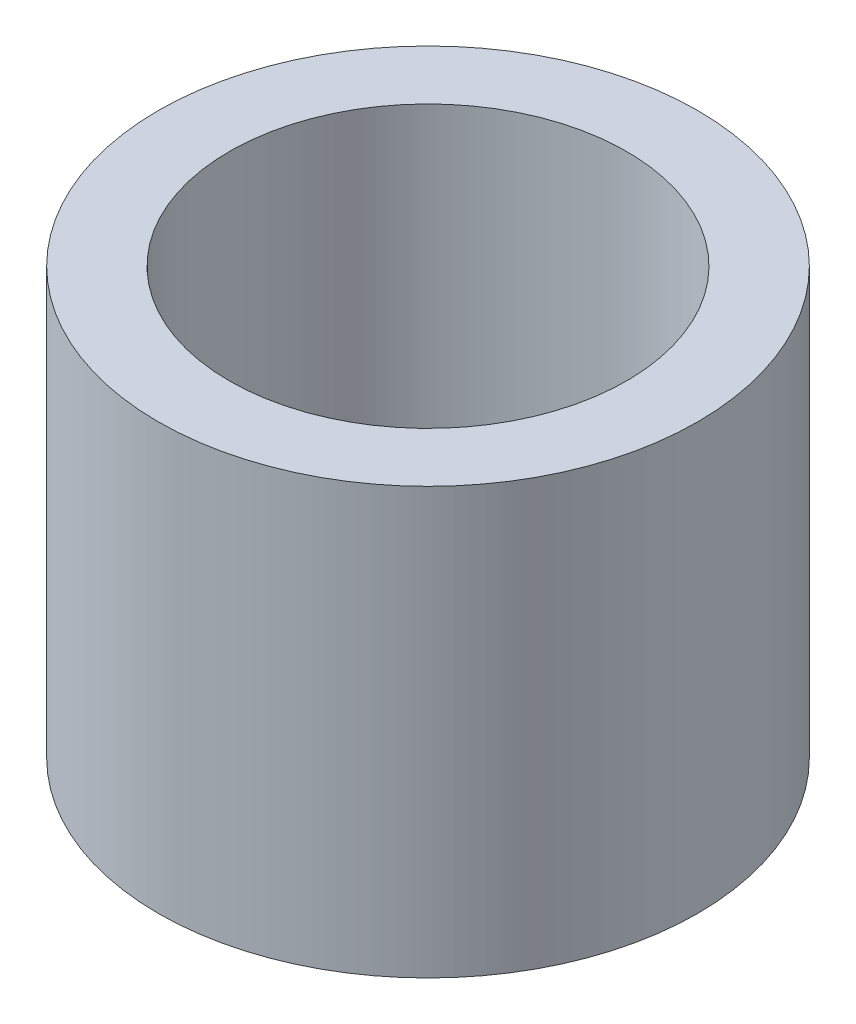
ISO-10303-21;
HEADER;
FILE_DESCRIPTION(('STEP AP214'),'2;1');
FILE_NAME('part.step','',(''),(''),'','','');
FILE_SCHEMA(('AUTOMOTIVE_DESIGN { 1 0 10303 214 1 1 1 1 }'));
ENDSEC;
DATA;
#1=APPLICATION_CONTEXT('core data for automotive mechanical design processes');
#2=APPLICATION_PROTOCOL_DEFINITION('international standard','automotive_design',2000,#1);
#3=PRODUCT_CONTEXT('',#1,'mechanical');
#4=PRODUCT('Part','Part','',(#3));
#5=PRODUCT_RELATED_PRODUCT_CATEGORY('part','',(#4));
#6=PRODUCT_DEFINITION_FORMATION('','',#4);
#7=PRODUCT_DEFINITION_CONTEXT('part definition',#1,'design');
#8=PRODUCT_DEFINITION('design','',#6,#7);
#9=PRODUCT_DEFINITION_SHAPE('','',#8);
#10=(LENGTH_UNIT() NAMED_UNIT(*) SI_UNIT(.MILLI.,.METRE.));
#11=(NAMED_UNIT(*) PLANE_ANGLE_UNIT() SI_UNIT($,.RADIAN.));
#12=(NAMED_UNIT(*) SI_UNIT($,.STERADIAN.) SOLID_ANGLE_UNIT());
#13=UNCERTAINTY_MEASURE_WITH_UNIT(LENGTH_MEASURE(1.E-05),#10,'distance_accuracy_value','');
#14=(GEOMETRIC_REPRESENTATION_CONTEXT(3) GLOBAL_UNCERTAINTY_ASSIGNED_CONTEXT((#13)) GLOBAL_UNIT_ASSIGNED_CONTEXT((#10,
#11,#12)) REPRESENTATION_CONTEXT('',''));
#15=CARTESIAN_POINT('',(0.,0.,0.));
#16=DIRECTION('',(0.,0.,1.));
#17=DIRECTION('',(1.,0.,0.));
#18=AXIS2_PLACEMENT_3D('',#15,#16,#17);
#19=CARTESIAN_POINT('',(0.,3.75,0.));
#20=DIRECTION('',(0.,1.,0.));
#21=DIRECTION('',(0.,0.,1.));
#22=AXIS2_PLACEMENT_3D('',#19,#20,#21);
#23=PLANE('',#22);
#24=CARTESIAN_POINT('',(0.,3.75,0.));
#25=DIRECTION('',(0.,1.,0.));
#26=DIRECTION('',(0.,0.,1.));
#27=AXIS2_PLACEMENT_3D('',#24,#25,#26);
#28=CIRCLE('',#27,4.75);
#29=CARTESIAN_POINT('',(0.,3.75,4.75));
#30=VERTEX_POINT('',#29);
#31=EDGE_CURVE('E10',#30,#30,#28,.T.);
#32=ORIENTED_EDGE('',*,*,#31,.T.);
#33=EDGE_LOOP('',(#32));
#34=FACE_BOUND('',#33,.T.);
#35=CARTESIAN_POINT('',(0.,3.75,0.));
#36=DIRECTION('',(0.,1.,0.));
#37=DIRECTION('',(0.,0.,1.));
#38=AXIS2_PLACEMENT_3D('',#35,#36,#37);
#39=CIRCLE('',#38,3.5);
#40=CARTESIAN_POINT('',(0.,3.75,3.5));
#41=VERTEX_POINT('',#40);
#42=EDGE_CURVE('E54',#41,#41,#39,.T.);
#43=ORIENTED_EDGE('',*,*,#42,.F.);
#44=EDGE_LOOP('',(#43));
#45=FACE_BOUND('',#44,.T.);
#46=ADVANCED_FACE('F41',(#34,#45),#23,.T.);
#47=CARTESIAN_POINT('',(0.,-3.75,0.));
#48=DIRECTION('',(0.,1.,0.));
#49=DIRECTION('',(0.,0.,1.));
#50=AXIS2_PLACEMENT_3D('',#47,#48,#49);
#51=PLANE('',#50);
#52=CARTESIAN_POINT('',(0.,-3.75,0.));
#53=DIRECTION('',(0.,1.,0.));
#54=DIRECTION('',(0.,0.,1.));
#55=AXIS2_PLACEMENT_3D('',#52,#53,#54);
#56=CIRCLE('',#55,4.75);
#57=CARTESIAN_POINT('',(0.,-3.75,4.75));
#58=VERTEX_POINT('',#57);
#59=EDGE_CURVE('E45',#58,#58,#56,.T.);
#60=ORIENTED_EDGE('',*,*,#59,.F.);
#61=EDGE_LOOP('',(#60));
#62=FACE_BOUND('',#61,.T.);
#63=CARTESIAN_POINT('',(0.,-3.75,0.));
#64=DIRECTION('',(0.,1.,0.));
#65=DIRECTION('',(0.,0.,1.));
#66=AXIS2_PLACEMENT_3D('',#63,#64,#65);
#67=CIRCLE('',#66,3.5);
#68=CARTESIAN_POINT('',(0.,-3.75,3.5));
#69=VERTEX_POINT('',#68);
#70=EDGE_CURVE('E56',#69,#69,#67,.T.);
#71=ORIENTED_EDGE('',*,*,#70,.T.);
#72=EDGE_LOOP('',(#71));
#73=FACE_BOUND('',#72,.T.);
#74=ADVANCED_FACE('F68',(#62,#73),#51,.F.);
#75=CARTESIAN_POINT('',(0.,3.75,0.));
#76=DIRECTION('',(0.,-1.,0.));
#77=DIRECTION('',(0.,0.,-1.));
#78=AXIS2_PLACEMENT_3D('',#75,#76,#77);
#79=CYLINDRICAL_SURFACE('',#78,4.75);
#80=ORIENTED_EDGE('',*,*,#31,.F.);
#81=EDGE_LOOP('',(#80));
#82=FACE_BOUND('',#81,.T.);
#83=ORIENTED_EDGE('',*,*,#59,.T.);
#84=EDGE_LOOP('',(#83));
#85=FACE_BOUND('',#84,.T.);
#86=ADVANCED_FACE('F43',(#82,#85),#79,.T.);
#87=CARTESIAN_POINT('',(0.,3.75,0.));
#88=DIRECTION('',(0.,-1.,0.));
#89=DIRECTION('',(0.,0.,-1.));
#90=AXIS2_PLACEMENT_3D('',#87,#88,#89);
#91=CYLINDRICAL_SURFACE('',#90,3.5);
#92=ORIENTED_EDGE('',*,*,#42,.T.);
#93=EDGE_LOOP('',(#92));
#94=FACE_BOUND('',#93,.T.);
#95=ORIENTED_EDGE('',*,*,#70,.F.);
#96=EDGE_LOOP('',(#95));
#97=FACE_BOUND('',#96,.T.);
#98=ADVANCED_FACE('F64',(#94,#97),#91,.F.);
#99=CLOSED_SHELL('',(#46,#74,#86,#98));
#100=MANIFOLD_SOLID_BREP('B2',#99);
#101=ADVANCED_BREP_SHAPE_REPRESENTATION('',(#18,#100),#14);
#102=SHAPE_DEFINITION_REPRESENTATION(#9,#101);
ENDSEC;
END-ISO-10303-21;
